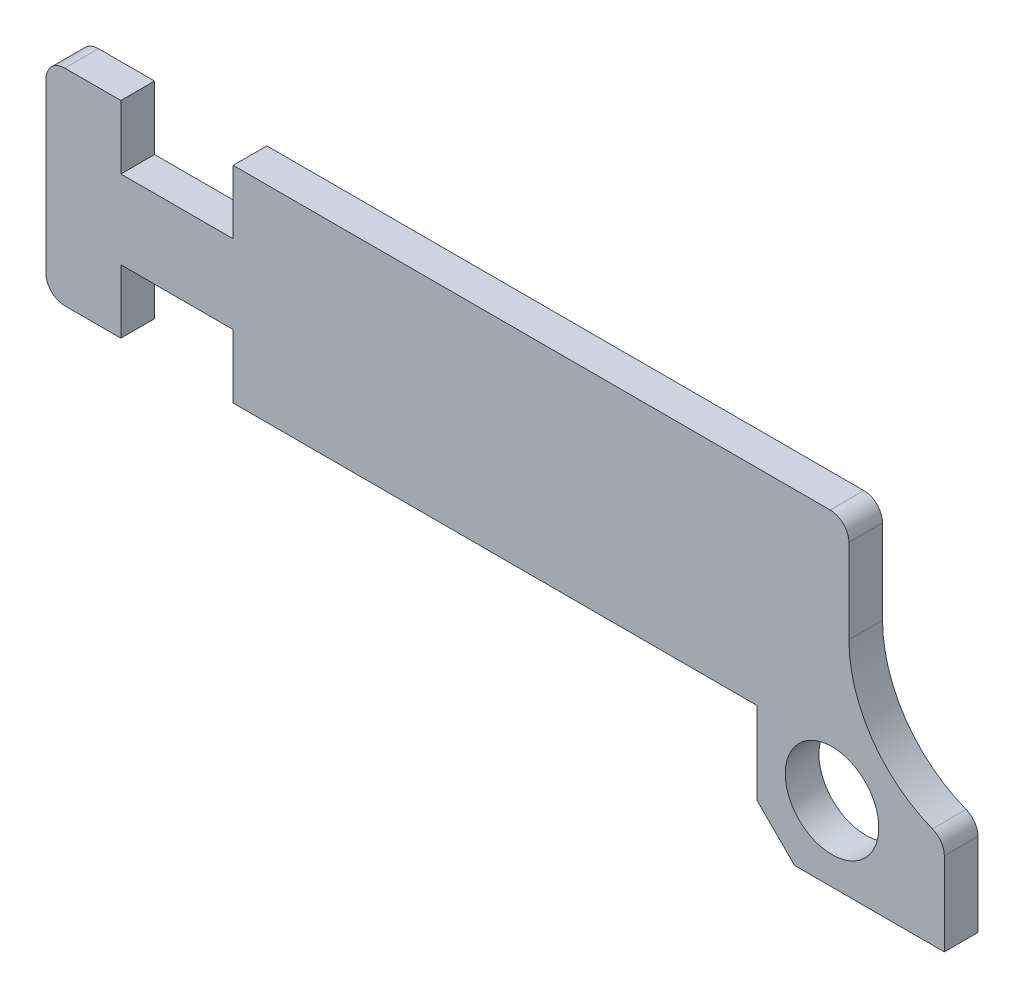
ISO-10303-21;
HEADER;
FILE_DESCRIPTION(('STEP AP214'),'2;1');
FILE_NAME('part.step','',(''),(''),'','','');
FILE_SCHEMA(('AUTOMOTIVE_DESIGN { 1 0 10303 214 1 1 1 1 }'));
ENDSEC;
DATA;
#1=APPLICATION_CONTEXT('core data for automotive mechanical design processes');
#2=APPLICATION_PROTOCOL_DEFINITION('international standard','automotive_design',2000,#1);
#3=PRODUCT_CONTEXT('',#1,'mechanical');
#4=PRODUCT('Part','Part','',(#3));
#5=PRODUCT_RELATED_PRODUCT_CATEGORY('part','',(#4));
#6=PRODUCT_DEFINITION_FORMATION('','',#4);
#7=PRODUCT_DEFINITION_CONTEXT('part definition',#1,'design');
#8=PRODUCT_DEFINITION('design','',#6,#7);
#9=PRODUCT_DEFINITION_SHAPE('','',#8);
#10=(LENGTH_UNIT() NAMED_UNIT(*) SI_UNIT(.MILLI.,.METRE.));
#11=(NAMED_UNIT(*) PLANE_ANGLE_UNIT() SI_UNIT($,.RADIAN.));
#12=(NAMED_UNIT(*) SI_UNIT($,.STERADIAN.) SOLID_ANGLE_UNIT());
#13=UNCERTAINTY_MEASURE_WITH_UNIT(LENGTH_MEASURE(1.E-05),#10,'distance_accuracy_value','');
#14=(GEOMETRIC_REPRESENTATION_CONTEXT(3) GLOBAL_UNCERTAINTY_ASSIGNED_CONTEXT((#13)) GLOBAL_UNIT_ASSIGNED_CONTEXT((#10,
#11,#12)) REPRESENTATION_CONTEXT('',''));
#15=CARTESIAN_POINT('',(0.,0.,0.));
#16=DIRECTION('',(0.,0.,1.));
#17=DIRECTION('',(1.,0.,0.));
#18=AXIS2_PLACEMENT_3D('',#15,#16,#17);
#19=CARTESIAN_POINT('',(-12.48691210598,-0.852250789584,0.9));
#20=DIRECTION('',(0.,0.,1.));
#21=DIRECTION('',(1.,0.,0.));
#22=AXIS2_PLACEMENT_3D('',#19,#20,#21);
#23=PLANE('',#22);
#24=CARTESIAN_POINT('',(-3.95,-3.95,0.9));
#25=DIRECTION('',(0.,0.,1.));
#26=DIRECTION('',(1.,0.,0.));
#27=AXIS2_PLACEMENT_3D('',#24,#25,#26);
#28=CIRCLE('',#27,1.25);
#29=CARTESIAN_POINT('',(-5.2,-3.95,0.9));
#30=VERTEX_POINT('',#29);
#31=EDGE_CURVE('E11',#30,#30,#28,.T.);
#32=ORIENTED_EDGE('',*,*,#31,.F.);
#33=EDGE_LOOP('',(#32));
#34=FACE_BOUND('',#33,.T.);
#35=DIRECTION('',(0.,1.,0.));
#36=VECTOR('',#35,1.);
#37=CARTESIAN_POINT('',(-5.95,-5.95,0.9));
#38=LINE('',#37,#36);
#39=CARTESIAN_POINT('',(-5.95,-4.95,0.9));
#40=VERTEX_POINT('',#39);
#41=CARTESIAN_POINT('',(-5.95,-2.75,0.9));
#42=VERTEX_POINT('',#41);
#43=EDGE_CURVE('E356',#40,#42,#38,.T.);
#44=ORIENTED_EDGE('',*,*,#43,.F.);
#45=DIRECTION('',(0.707106781186548,-0.707106781186548,0.));
#46=VECTOR('',#45,1.);
#47=CARTESIAN_POINT('',(-8.3586653291,-2.5413346709,0.9));
#48=LINE('',#47,#46);
#49=CARTESIAN_POINT('',(-4.95,-5.95,0.9));
#50=VERTEX_POINT('',#49);
#51=EDGE_CURVE('E315',#40,#50,#48,.T.);
#52=ORIENTED_EDGE('',*,*,#51,.T.);
#53=DIRECTION('',(-1.,0.,0.));
#54=VECTOR('',#53,1.);
#55=CARTESIAN_POINT('',(-0.95,-5.95,0.9));
#56=LINE('',#55,#54);
#57=CARTESIAN_POINT('',(-0.95,-5.95,0.9));
#58=VERTEX_POINT('',#57);
#59=EDGE_CURVE('E398',#58,#50,#56,.T.);
#60=ORIENTED_EDGE('',*,*,#59,.F.);
#61=DIRECTION('',(0.,-1.,0.));
#62=VECTOR('',#61,1.);
#63=CARTESIAN_POINT('',(-0.95,-3.727935085272,0.9));
#64=LINE('',#63,#62);
#65=CARTESIAN_POINT('',(-0.95,-3.727935085272,0.9));
#66=VERTEX_POINT('',#65);
#67=EDGE_CURVE('E282',#66,#58,#64,.T.);
#68=ORIENTED_EDGE('',*,*,#67,.F.);
#69=CARTESIAN_POINT('',(-1.45,-3.727935085272,0.9));
#70=DIRECTION('',(0.,0.,1.));
#71=DIRECTION('',(1.,0.,0.));
#72=AXIS2_PLACEMENT_3D('',#69,#70,#71);
#73=CIRCLE('',#72,0.5);
#74=CARTESIAN_POINT('',(-1.26875,-3.261943199613,0.9));
#75=VERTEX_POINT('',#74);
#76=EDGE_CURVE('E291',#66,#75,#73,.T.);
#77=ORIENTED_EDGE('',*,*,#76,.T.);
#78=CARTESIAN_POINT('',(0.,0.,0.9));
#79=DIRECTION('',(0.,0.,1.));
#80=DIRECTION('',(1.,0.,0.));
#81=AXIS2_PLACEMENT_3D('',#78,#79,#80);
#82=CIRCLE('',#81,3.5);
#83=CARTESIAN_POINT('',(-3.5,0.,0.9));
#84=VERTEX_POINT('',#83);
#85=EDGE_CURVE('E270',#84,#75,#82,.T.);
#86=ORIENTED_EDGE('',*,*,#85,.F.);
#87=DIRECTION('',(0.,-1.,0.));
#88=VECTOR('',#87,1.);
#89=CARTESIAN_POINT('',(-3.5,2.25,0.9));
#90=LINE('',#89,#88);
#91=CARTESIAN_POINT('',(-3.5,2.25,0.9));
#92=VERTEX_POINT('',#91);
#93=EDGE_CURVE('E418',#92,#84,#90,.T.);
#94=ORIENTED_EDGE('',*,*,#93,.F.);
#95=CARTESIAN_POINT('',(-4.,2.25,0.9));
#96=DIRECTION('',(0.,0.,1.));
#97=DIRECTION('',(1.,0.,0.));
#98=AXIS2_PLACEMENT_3D('',#95,#96,#97);
#99=CIRCLE('',#98,0.5);
#100=CARTESIAN_POINT('',(-4.,2.75,0.9));
#101=VERTEX_POINT('',#100);
#102=EDGE_CURVE('E283',#92,#101,#99,.T.);
#103=ORIENTED_EDGE('',*,*,#102,.T.);
#104=DIRECTION('',(1.,0.,0.));
#105=VECTOR('',#104,1.);
#106=CARTESIAN_POINT('',(-24.95,2.75,0.9));
#107=LINE('',#106,#105);
#108=CARTESIAN_POINT('',(-19.95,2.75,0.9));
#109=VERTEX_POINT('',#108);
#110=EDGE_CURVE('E266',#109,#101,#107,.T.);
#111=ORIENTED_EDGE('',*,*,#110,.F.);
#112=DIRECTION('',(0.,-1.,0.));
#113=VECTOR('',#112,1.);
#114=CARTESIAN_POINT('',(-19.95,2.75,0.9));
#115=LINE('',#114,#113);
#116=CARTESIAN_POINT('',(-19.95,1.05,0.9));
#117=VERTEX_POINT('',#116);
#118=EDGE_CURVE('E339',#109,#117,#115,.T.);
#119=ORIENTED_EDGE('',*,*,#118,.T.);
#120=DIRECTION('',(-1.,0.,0.));
#121=VECTOR('',#120,1.);
#122=CARTESIAN_POINT('',(-19.95,1.05,0.9));
#123=LINE('',#122,#121);
#124=CARTESIAN_POINT('',(-22.95,1.05,0.9));
#125=VERTEX_POINT('',#124);
#126=EDGE_CURVE('E386',#117,#125,#123,.T.);
#127=ORIENTED_EDGE('',*,*,#126,.T.);
#128=DIRECTION('',(0.,1.,0.));
#129=VECTOR('',#128,1.);
#130=CARTESIAN_POINT('',(-22.95,1.05,0.9));
#131=LINE('',#130,#129);
#132=CARTESIAN_POINT('',(-22.95,2.75,0.9));
#133=VERTEX_POINT('',#132);
#134=EDGE_CURVE('E257',#125,#133,#131,.T.);
#135=ORIENTED_EDGE('',*,*,#134,.T.);
#136=DIRECTION('',(1.,0.,0.));
#137=VECTOR('',#136,1.);
#138=CARTESIAN_POINT('',(-24.95,2.75,0.9));
#139=LINE('',#138,#137);
#140=CARTESIAN_POINT('',(-24.45,2.75,0.9));
#141=VERTEX_POINT('',#140);
#142=EDGE_CURVE('E390',#141,#133,#139,.T.);
#143=ORIENTED_EDGE('',*,*,#142,.F.);
#144=CARTESIAN_POINT('',(-24.45,2.25,0.9));
#145=DIRECTION('',(0.,0.,-1.));
#146=DIRECTION('',(0.,-1.,0.));
#147=AXIS2_PLACEMENT_3D('',#144,#145,#146);
#148=CIRCLE('',#147,0.5);
#149=CARTESIAN_POINT('',(-24.95,2.25,0.9));
#150=VERTEX_POINT('',#149);
#151=EDGE_CURVE('E261',#150,#141,#148,.T.);
#152=ORIENTED_EDGE('',*,*,#151,.F.);
#153=DIRECTION('',(0.,-1.,0.));
#154=VECTOR('',#153,1.);
#155=CARTESIAN_POINT('',(-24.95,2.75,0.9));
#156=LINE('',#155,#154);
#157=CARTESIAN_POINT('',(-24.95,-2.25,0.9));
#158=VERTEX_POINT('',#157);
#159=EDGE_CURVE('E287',#150,#158,#156,.T.);
#160=ORIENTED_EDGE('',*,*,#159,.T.);
#161=CARTESIAN_POINT('',(-24.45,-2.25,0.9));
#162=DIRECTION('',(0.,0.,-1.));
#163=DIRECTION('',(0.,-1.,0.));
#164=AXIS2_PLACEMENT_3D('',#161,#162,#163);
#165=CIRCLE('',#164,0.5);
#166=CARTESIAN_POINT('',(-24.45,-2.75,0.9));
#167=VERTEX_POINT('',#166);
#168=EDGE_CURVE('E218',#167,#158,#165,.T.);
#169=ORIENTED_EDGE('',*,*,#168,.F.);
#170=DIRECTION('',(-1.,0.,0.));
#171=VECTOR('',#170,1.);
#172=CARTESIAN_POINT('',(-5.95,-2.75,0.9));
#173=LINE('',#172,#171);
#174=CARTESIAN_POINT('',(-22.95,-2.75,0.9));
#175=VERTEX_POINT('',#174);
#176=EDGE_CURVE('E334',#175,#167,#173,.T.);
#177=ORIENTED_EDGE('',*,*,#176,.F.);
#178=DIRECTION('',(0.,-1.,0.));
#179=VECTOR('',#178,1.);
#180=CARTESIAN_POINT('',(-22.95,-1.049999999973,0.9));
#181=LINE('',#180,#179);
#182=CARTESIAN_POINT('',(-22.95,-1.049999999973,0.9));
#183=VERTEX_POINT('',#182);
#184=EDGE_CURVE('E256',#183,#175,#181,.T.);
#185=ORIENTED_EDGE('',*,*,#184,.F.);
#186=DIRECTION('',(-1.,0.,0.));
#187=VECTOR('',#186,1.);
#188=CARTESIAN_POINT('',(-19.95,-1.049999999973,0.9));
#189=LINE('',#188,#187);
#190=CARTESIAN_POINT('',(-19.95,-1.049999999973,0.9));
#191=VERTEX_POINT('',#190);
#192=EDGE_CURVE('E277',#191,#183,#189,.T.);
#193=ORIENTED_EDGE('',*,*,#192,.F.);
#194=DIRECTION('',(0.,1.,0.));
#195=VECTOR('',#194,1.);
#196=CARTESIAN_POINT('',(-19.95,-2.75,0.9));
#197=LINE('',#196,#195);
#198=CARTESIAN_POINT('',(-19.95,-2.75,0.9));
#199=VERTEX_POINT('',#198);
#200=EDGE_CURVE('E343',#199,#191,#197,.T.);
#201=ORIENTED_EDGE('',*,*,#200,.F.);
#202=DIRECTION('',(-1.,0.,0.));
#203=VECTOR('',#202,1.);
#204=CARTESIAN_POINT('',(-5.95,-2.75,0.9));
#205=LINE('',#204,#203);
#206=EDGE_CURVE('E312',#42,#199,#205,.T.);
#207=ORIENTED_EDGE('',*,*,#206,.F.);
#208=EDGE_LOOP('',(#44,#52,#60,#68,#77,#86,#94,#103,#111,#119,#127,#135,#143,#152,#160,#169,
#177,#185,#193,#201,#207));
#209=FACE_BOUND('',#208,.T.);
#210=ADVANCED_FACE('F17',(#34,#209),#23,.T.);
#211=CARTESIAN_POINT('',(-3.95,-3.95,0.9));
#212=DIRECTION('',(0.,0.,1.));
#213=DIRECTION('',(1.,0.,0.));
#214=AXIS2_PLACEMENT_3D('',#211,#212,#213);
#215=CYLINDRICAL_SURFACE('',#214,1.25);
#216=CARTESIAN_POINT('',(-3.95,-3.95,0.));
#217=DIRECTION('',(0.,0.,1.));
#218=DIRECTION('',(1.,0.,0.));
#219=AXIS2_PLACEMENT_3D('',#216,#217,#218);
#220=CIRCLE('',#219,1.25);
#221=CARTESIAN_POINT('',(-5.2,-3.95,0.));
#222=VERTEX_POINT('',#221);
#223=EDGE_CURVE('E382',#222,#222,#220,.T.);
#224=ORIENTED_EDGE('',*,*,#223,.F.);
#225=DIRECTION('',(0.,0.,1.));
#226=VECTOR('',#225,1.);
#227=CARTESIAN_POINT('',(-5.2,-3.95,0.9));
#228=LINE('',#227,#226);
#229=EDGE_CURVE('E28',#222,#30,#228,.T.);
#230=ORIENTED_EDGE('',*,*,#229,.T.);
#231=ORIENTED_EDGE('',*,*,#31,.T.);
#232=ORIENTED_EDGE('',*,*,#229,.F.);
#233=EDGE_LOOP('',(#224,#230,#231,#232));
#234=FACE_BOUND('',#233,.T.);
#235=ADVANCED_FACE('F19',(#234),#215,.F.);
#236=CARTESIAN_POINT('',(-22.95,1.05,0.9));
#237=DIRECTION('',(1.,0.,0.));
#238=DIRECTION('',(0.,1.,0.));
#239=AXIS2_PLACEMENT_3D('',#236,#237,#238);
#240=PLANE('',#239);
#241=ORIENTED_EDGE('',*,*,#134,.F.);
#242=DIRECTION('',(0.,0.,-1.));
#243=VECTOR('',#242,1.);
#244=CARTESIAN_POINT('',(-22.95,1.05,0.9));
#245=LINE('',#244,#243);
#246=CARTESIAN_POINT('',(-22.95,1.05,0.));
#247=VERTEX_POINT('',#246);
#248=EDGE_CURVE('E260',#125,#247,#245,.T.);
#249=ORIENTED_EDGE('',*,*,#248,.T.);
#250=DIRECTION('',(0.,1.,0.));
#251=VECTOR('',#250,1.);
#252=CARTESIAN_POINT('',(-22.95,0.09887460520782,0.));
#253=LINE('',#252,#251);
#254=CARTESIAN_POINT('',(-22.95,2.75,0.));
#255=VERTEX_POINT('',#254);
#256=EDGE_CURVE('E292',#247,#255,#253,.T.);
#257=ORIENTED_EDGE('',*,*,#256,.T.);
#258=DIRECTION('',(0.,0.,-1.));
#259=VECTOR('',#258,1.);
#260=CARTESIAN_POINT('',(-22.95,2.75,0.9));
#261=LINE('',#260,#259);
#262=EDGE_CURVE('E394',#133,#255,#261,.T.);
#263=ORIENTED_EDGE('',*,*,#262,.F.);
#264=EDGE_LOOP('',(#241,#249,#257,#263));
#265=FACE_BOUND('',#264,.T.);
#266=ADVANCED_FACE('F597',(#265),#240,.T.);
#267=CARTESIAN_POINT('',(-19.95,1.05,0.9));
#268=DIRECTION('',(0.,1.,0.));
#269=DIRECTION('',(1.,0.,0.));
#270=AXIS2_PLACEMENT_3D('',#267,#268,#269);
#271=PLANE('',#270);
#272=ORIENTED_EDGE('',*,*,#126,.F.);
#273=DIRECTION('',(0.,0.,-1.));
#274=VECTOR('',#273,1.);
#275=CARTESIAN_POINT('',(-19.95,1.05,0.9));
#276=LINE('',#275,#274);
#277=CARTESIAN_POINT('',(-19.95,1.05,0.));
#278=VERTEX_POINT('',#277);
#279=EDGE_CURVE('E377',#117,#278,#276,.T.);
#280=ORIENTED_EDGE('',*,*,#279,.T.);
#281=DIRECTION('',(-1.,0.,0.));
#282=VECTOR('',#281,1.);
#283=CARTESIAN_POINT('',(-16.21845605299,1.05,0.));
#284=LINE('',#283,#282);
#285=EDGE_CURVE('E296',#278,#247,#284,.T.);
#286=ORIENTED_EDGE('',*,*,#285,.T.);
#287=ORIENTED_EDGE('',*,*,#248,.F.);
#288=EDGE_LOOP('',(#272,#280,#286,#287));
#289=FACE_BOUND('',#288,.T.);
#290=ADVANCED_FACE('F591',(#289),#271,.T.);
#291=CARTESIAN_POINT('',(-24.95,2.75,0.));
#292=DIRECTION('',(0.,1.,0.));
#293=DIRECTION('',(1.,0.,0.));
#294=AXIS2_PLACEMENT_3D('',#291,#292,#293);
#295=PLANE('',#294);
#296=DIRECTION('',(1.,0.,0.));
#297=VECTOR('',#296,1.);
#298=CARTESIAN_POINT('',(-24.95,2.75,0.));
#299=LINE('',#298,#297);
#300=CARTESIAN_POINT('',(-24.45,2.75,0.));
#301=VERTEX_POINT('',#300);
#302=EDGE_CURVE('E297',#301,#255,#299,.T.);
#303=ORIENTED_EDGE('',*,*,#302,.F.);
#304=DIRECTION('',(0.,0.,1.));
#305=VECTOR('',#304,1.);
#306=CARTESIAN_POINT('',(-24.45,2.75,0.));
#307=LINE('',#306,#305);
#308=EDGE_CURVE('E265',#301,#141,#307,.T.);
#309=ORIENTED_EDGE('',*,*,#308,.T.);
#310=ORIENTED_EDGE('',*,*,#142,.T.);
#311=ORIENTED_EDGE('',*,*,#262,.T.);
#312=EDGE_LOOP('',(#303,#309,#310,#311));
#313=FACE_BOUND('',#312,.T.);
#314=ADVANCED_FACE('F585',(#313),#295,.T.);
#315=CARTESIAN_POINT('',(-19.95,2.75,0.9));
#316=DIRECTION('',(-1.,0.,0.));
#317=DIRECTION('',(0.,0.,1.));
#318=AXIS2_PLACEMENT_3D('',#315,#316,#317);
#319=PLANE('',#318);
#320=ORIENTED_EDGE('',*,*,#118,.F.);
#321=DIRECTION('',(0.,0.,-1.));
#322=VECTOR('',#321,1.);
#323=CARTESIAN_POINT('',(-19.95,2.75,0.9));
#324=LINE('',#323,#322);
#325=CARTESIAN_POINT('',(-19.95,2.75,0.));
#326=VERTEX_POINT('',#325);
#327=EDGE_CURVE('E347',#109,#326,#324,.T.);
#328=ORIENTED_EDGE('',*,*,#327,.T.);
#329=DIRECTION('',(0.,-1.,0.));
#330=VECTOR('',#329,1.);
#331=CARTESIAN_POINT('',(-19.95,0.948874605208,0.));
#332=LINE('',#331,#330);
#333=EDGE_CURVE('E304',#326,#278,#332,.T.);
#334=ORIENTED_EDGE('',*,*,#333,.T.);
#335=ORIENTED_EDGE('',*,*,#279,.F.);
#336=EDGE_LOOP('',(#320,#328,#334,#335));
#337=FACE_BOUND('',#336,.T.);
#338=ADVANCED_FACE('F590',(#337),#319,.T.);
#339=CARTESIAN_POINT('',(-24.45,2.25,0.));
#340=DIRECTION('',(0.,0.,1.));
#341=DIRECTION('',(-1.,0.,0.));
#342=AXIS2_PLACEMENT_3D('',#339,#340,#341);
#343=CYLINDRICAL_SURFACE('',#342,0.5);
#344=CARTESIAN_POINT('',(-24.45,2.25,0.));
#345=DIRECTION('',(0.,0.,-1.));
#346=DIRECTION('',(0.,-1.,0.));
#347=AXIS2_PLACEMENT_3D('',#344,#345,#346);
#348=CIRCLE('',#347,0.5);
#349=CARTESIAN_POINT('',(-24.95,2.25,0.));
#350=VERTEX_POINT('',#349);
#351=EDGE_CURVE('E233',#350,#301,#348,.T.);
#352=ORIENTED_EDGE('',*,*,#351,.F.);
#353=DIRECTION('',(0.,0.,1.));
#354=VECTOR('',#353,1.);
#355=CARTESIAN_POINT('',(-24.95,2.25,0.));
#356=LINE('',#355,#354);
#357=EDGE_CURVE('E228',#350,#150,#356,.T.);
#358=ORIENTED_EDGE('',*,*,#357,.T.);
#359=ORIENTED_EDGE('',*,*,#151,.T.);
#360=ORIENTED_EDGE('',*,*,#308,.F.);
#361=EDGE_LOOP('',(#352,#358,#359,#360));
#362=FACE_BOUND('',#361,.T.);
#363=ADVANCED_FACE('F607',(#362),#343,.T.);
#364=CARTESIAN_POINT('',(-24.95,2.75,0.));
#365=DIRECTION('',(0.,1.,0.));
#366=DIRECTION('',(1.,0.,0.));
#367=AXIS2_PLACEMENT_3D('',#364,#365,#366);
#368=PLANE('',#367);
#369=DIRECTION('',(1.,0.,0.));
#370=VECTOR('',#369,1.);
#371=CARTESIAN_POINT('',(-24.95,2.75,0.));
#372=LINE('',#371,#370);
#373=CARTESIAN_POINT('',(-4.,2.75,0.));
#374=VERTEX_POINT('',#373);
#375=EDGE_CURVE('E308',#326,#374,#372,.T.);
#376=ORIENTED_EDGE('',*,*,#375,.F.);
#377=ORIENTED_EDGE('',*,*,#327,.F.);
#378=ORIENTED_EDGE('',*,*,#110,.T.);
#379=DIRECTION('',(0.,0.,1.));
#380=VECTOR('',#379,1.);
#381=CARTESIAN_POINT('',(-4.,2.75,0.));
#382=LINE('',#381,#380);
#383=EDGE_CURVE('E222',#374,#101,#382,.T.);
#384=ORIENTED_EDGE('',*,*,#383,.F.);
#385=EDGE_LOOP('',(#376,#377,#378,#384));
#386=FACE_BOUND('',#385,.T.);
#387=ADVANCED_FACE('F612',(#386),#368,.T.);
#388=CARTESIAN_POINT('',(-24.95,2.75,0.));
#389=DIRECTION('',(1.,0.,0.));
#390=DIRECTION('',(0.,1.,0.));
#391=AXIS2_PLACEMENT_3D('',#388,#389,#390);
#392=PLANE('',#391);
#393=DIRECTION('',(0.,-1.,0.));
#394=VECTOR('',#393,1.);
#395=CARTESIAN_POINT('',(-24.95,2.75,0.));
#396=LINE('',#395,#394);
#397=CARTESIAN_POINT('',(-24.95,-2.25,0.));
#398=VERTEX_POINT('',#397);
#399=EDGE_CURVE('E225',#350,#398,#396,.T.);
#400=ORIENTED_EDGE('',*,*,#399,.T.);
#401=DIRECTION('',(0.,0.,1.));
#402=VECTOR('',#401,1.);
#403=CARTESIAN_POINT('',(-24.95,-2.25,0.));
#404=LINE('',#403,#402);
#405=EDGE_CURVE('E211',#398,#158,#404,.T.);
#406=ORIENTED_EDGE('',*,*,#405,.T.);
#407=ORIENTED_EDGE('',*,*,#159,.F.);
#408=ORIENTED_EDGE('',*,*,#357,.F.);
#409=EDGE_LOOP('',(#400,#406,#407,#408));
#410=FACE_BOUND('',#409,.T.);
#411=ADVANCED_FACE('F226',(#410),#392,.F.);
#412=CARTESIAN_POINT('',(-4.,2.25,0.));
#413=DIRECTION('',(0.,0.,-1.));
#414=DIRECTION('',(1.,0.,0.));
#415=AXIS2_PLACEMENT_3D('',#412,#413,#414);
#416=CYLINDRICAL_SURFACE('',#415,0.5);
#417=DIRECTION('',(0.,0.,1.));
#418=VECTOR('',#417,1.);
#419=CARTESIAN_POINT('',(-3.5,2.25,0.));
#420=LINE('',#419,#418);
#421=CARTESIAN_POINT('',(-3.5,2.25,0.));
#422=VERTEX_POINT('',#421);
#423=EDGE_CURVE('E414',#422,#92,#420,.T.);
#424=ORIENTED_EDGE('',*,*,#423,.F.);
#425=CARTESIAN_POINT('',(-4.,2.25,0.));
#426=DIRECTION('',(0.,0.,1.));
#427=DIRECTION('',(1.,0.,0.));
#428=AXIS2_PLACEMENT_3D('',#425,#426,#427);
#429=CIRCLE('',#428,0.5);
#430=EDGE_CURVE('E276',#422,#374,#429,.T.);
#431=ORIENTED_EDGE('',*,*,#430,.T.);
#432=ORIENTED_EDGE('',*,*,#383,.T.);
#433=ORIENTED_EDGE('',*,*,#102,.F.);
#434=EDGE_LOOP('',(#424,#431,#432,#433));
#435=FACE_BOUND('',#434,.T.);
#436=ADVANCED_FACE('F644',(#435),#416,.T.);
#437=CARTESIAN_POINT('',(-24.45,-2.25,0.));
#438=DIRECTION('',(0.,0.,1.));
#439=DIRECTION('',(0.,-1.,0.));
#440=AXIS2_PLACEMENT_3D('',#437,#438,#439);
#441=CYLINDRICAL_SURFACE('',#440,0.5);
#442=CARTESIAN_POINT('',(-24.45,-2.25,0.));
#443=DIRECTION('',(0.,0.,-1.));
#444=DIRECTION('',(0.,-1.,0.));
#445=AXIS2_PLACEMENT_3D('',#442,#443,#444);
#446=CIRCLE('',#445,0.5);
#447=CARTESIAN_POINT('',(-24.45,-2.75,0.));
#448=VERTEX_POINT('',#447);
#449=EDGE_CURVE('E216',#448,#398,#446,.T.);
#450=ORIENTED_EDGE('',*,*,#449,.F.);
#451=DIRECTION('',(0.,0.,1.));
#452=VECTOR('',#451,1.);
#453=CARTESIAN_POINT('',(-24.45,-2.75,0.));
#454=LINE('',#453,#452);
#455=EDGE_CURVE('E419',#448,#167,#454,.T.);
#456=ORIENTED_EDGE('',*,*,#455,.T.);
#457=ORIENTED_EDGE('',*,*,#168,.T.);
#458=ORIENTED_EDGE('',*,*,#405,.F.);
#459=EDGE_LOOP('',(#450,#456,#457,#458));
#460=FACE_BOUND('',#459,.T.);
#461=ADVANCED_FACE('F213',(#460),#441,.T.);
#462=CARTESIAN_POINT('',(-3.5,2.25,0.));
#463=DIRECTION('',(1.,0.,0.));
#464=DIRECTION('',(0.,1.,0.));
#465=AXIS2_PLACEMENT_3D('',#462,#463,#464);
#466=PLANE('',#465);
#467=ORIENTED_EDGE('',*,*,#423,.T.);
#468=ORIENTED_EDGE('',*,*,#93,.T.);
#469=DIRECTION('',(0.,0.,1.));
#470=VECTOR('',#469,1.);
#471=CARTESIAN_POINT('',(-3.5,0.,0.));
#472=LINE('',#471,#470);
#473=CARTESIAN_POINT('',(-3.5,0.,0.));
#474=VERTEX_POINT('',#473);
#475=EDGE_CURVE('E255',#474,#84,#472,.T.);
#476=ORIENTED_EDGE('',*,*,#475,.F.);
#477=DIRECTION('',(0.,-1.,0.));
#478=VECTOR('',#477,1.);
#479=CARTESIAN_POINT('',(-3.5,2.25,0.));
#480=LINE('',#479,#478);
#481=EDGE_CURVE('E271',#422,#474,#480,.T.);
#482=ORIENTED_EDGE('',*,*,#481,.F.);
#483=EDGE_LOOP('',(#467,#468,#476,#482));
#484=FACE_BOUND('',#483,.T.);
#485=ADVANCED_FACE('F670',(#484),#466,.T.);
#486=CARTESIAN_POINT('',(-5.95,-2.75,0.));
#487=DIRECTION('',(0.,-1.,0.));
#488=DIRECTION('',(0.,0.,-1.));
#489=AXIS2_PLACEMENT_3D('',#486,#487,#488);
#490=PLANE('',#489);
#491=DIRECTION('',(-1.,0.,0.));
#492=VECTOR('',#491,1.);
#493=CARTESIAN_POINT('',(-5.95,-2.75,0.));
#494=LINE('',#493,#492);
#495=CARTESIAN_POINT('',(-22.95,-2.75,0.));
#496=VERTEX_POINT('',#495);
#497=EDGE_CURVE('E239',#496,#448,#494,.T.);
#498=ORIENTED_EDGE('',*,*,#497,.F.);
#499=DIRECTION('',(0.,0.,-1.));
#500=VECTOR('',#499,1.);
#501=CARTESIAN_POINT('',(-22.95,-2.75,0.9));
#502=LINE('',#501,#500);
#503=EDGE_CURVE('E252',#175,#496,#502,.T.);
#504=ORIENTED_EDGE('',*,*,#503,.F.);
#505=ORIENTED_EDGE('',*,*,#176,.T.);
#506=ORIENTED_EDGE('',*,*,#455,.F.);
#507=EDGE_LOOP('',(#498,#504,#505,#506));
#508=FACE_BOUND('',#507,.T.);
#509=ADVANCED_FACE('F680',(#508),#490,.T.);
#510=CARTESIAN_POINT('',(0.,0.,0.));
#511=DIRECTION('',(0.,0.,-1.));
#512=DIRECTION('',(1.,0.,0.));
#513=AXIS2_PLACEMENT_3D('',#510,#511,#512);
#514=CYLINDRICAL_SURFACE('',#513,3.5);
#515=ORIENTED_EDGE('',*,*,#475,.T.);
#516=ORIENTED_EDGE('',*,*,#85,.T.);
#517=DIRECTION('',(0.,0.,1.));
#518=VECTOR('',#517,1.);
#519=CARTESIAN_POINT('',(-1.26875,-3.261943199613,0.));
#520=LINE('',#519,#518);
#521=CARTESIAN_POINT('',(-1.26875,-3.261943199613,0.));
#522=VERTEX_POINT('',#521);
#523=EDGE_CURVE('E351',#522,#75,#520,.T.);
#524=ORIENTED_EDGE('',*,*,#523,.F.);
#525=CARTESIAN_POINT('',(0.,0.,0.));
#526=DIRECTION('',(0.,0.,1.));
#527=DIRECTION('',(1.,0.,0.));
#528=AXIS2_PLACEMENT_3D('',#525,#526,#527);
#529=CIRCLE('',#528,3.5);
#530=EDGE_CURVE('E275',#474,#522,#529,.T.);
#531=ORIENTED_EDGE('',*,*,#530,.F.);
#532=EDGE_LOOP('',(#515,#516,#524,#531));
#533=FACE_BOUND('',#532,.T.);
#534=ADVANCED_FACE('F675',(#533),#514,.F.);
#535=CARTESIAN_POINT('',(-22.95,-1.049999999973,0.9));
#536=DIRECTION('',(-1.,0.,0.));
#537=DIRECTION('',(0.,0.,1.));
#538=AXIS2_PLACEMENT_3D('',#535,#536,#537);
#539=PLANE('',#538);
#540=ORIENTED_EDGE('',*,*,#184,.T.);
#541=ORIENTED_EDGE('',*,*,#503,.T.);
#542=DIRECTION('',(0.,-1.,0.));
#543=VECTOR('',#542,1.);
#544=CARTESIAN_POINT('',(-22.95,-0.951125394779,0.));
#545=LINE('',#544,#543);
#546=CARTESIAN_POINT('',(-22.95,-1.049999999973,0.));
#547=VERTEX_POINT('',#546);
#548=EDGE_CURVE('E246',#547,#496,#545,.T.);
#549=ORIENTED_EDGE('',*,*,#548,.F.);
#550=DIRECTION('',(0.,0.,-1.));
#551=VECTOR('',#550,1.);
#552=CARTESIAN_POINT('',(-22.95,-1.049999999973,0.9));
#553=LINE('',#552,#551);
#554=EDGE_CURVE('E281',#183,#547,#553,.T.);
#555=ORIENTED_EDGE('',*,*,#554,.F.);
#556=EDGE_LOOP('',(#540,#541,#549,#555));
#557=FACE_BOUND('',#556,.T.);
#558=ADVANCED_FACE('F633',(#557),#539,.F.);
#559=CARTESIAN_POINT('',(-1.45,-3.727935085272,0.));
#560=DIRECTION('',(0.,0.,-1.));
#561=DIRECTION('',(1.,0.,0.));
#562=AXIS2_PLACEMENT_3D('',#559,#560,#561);
#563=CYLINDRICAL_SURFACE('',#562,0.5);
#564=DIRECTION('',(0.,0.,1.));
#565=VECTOR('',#564,1.);
#566=CARTESIAN_POINT('',(-0.95,-3.727935085272,0.));
#567=LINE('',#566,#565);
#568=CARTESIAN_POINT('',(-0.95,-3.727935085272,0.));
#569=VERTEX_POINT('',#568);
#570=EDGE_CURVE('E342',#569,#66,#567,.T.);
#571=ORIENTED_EDGE('',*,*,#570,.F.);
#572=CARTESIAN_POINT('',(-1.45,-3.727935085272,0.));
#573=DIRECTION('',(0.,0.,1.));
#574=DIRECTION('',(1.,0.,0.));
#575=AXIS2_PLACEMENT_3D('',#572,#573,#574);
#576=CIRCLE('',#575,0.5);
#577=EDGE_CURVE('E354',#569,#522,#576,.T.);
#578=ORIENTED_EDGE('',*,*,#577,.T.);
#579=ORIENTED_EDGE('',*,*,#523,.T.);
#580=ORIENTED_EDGE('',*,*,#76,.F.);
#581=EDGE_LOOP('',(#571,#578,#579,#580));
#582=FACE_BOUND('',#581,.T.);
#583=ADVANCED_FACE('F627',(#582),#563,.T.);
#584=CARTESIAN_POINT('',(-19.95,-1.049999999973,0.9));
#585=DIRECTION('',(0.,1.,0.));
#586=DIRECTION('',(1.,0.,0.));
#587=AXIS2_PLACEMENT_3D('',#584,#585,#586);
#588=PLANE('',#587);
#589=ORIENTED_EDGE('',*,*,#192,.T.);
#590=ORIENTED_EDGE('',*,*,#554,.T.);
#591=DIRECTION('',(-1.,0.,0.));
#592=VECTOR('',#591,1.);
#593=CARTESIAN_POINT('',(-16.21845605299,-1.049999999973,0.));
#594=LINE('',#593,#592);
#595=CARTESIAN_POINT('',(-19.95,-1.049999999973,0.));
#596=VERTEX_POINT('',#595);
#597=EDGE_CURVE('E367',#596,#547,#594,.T.);
#598=ORIENTED_EDGE('',*,*,#597,.F.);
#599=DIRECTION('',(0.,0.,-1.));
#600=VECTOR('',#599,1.);
#601=CARTESIAN_POINT('',(-19.95,-1.049999999973,0.9));
#602=LINE('',#601,#600);
#603=EDGE_CURVE('E340',#191,#596,#602,.T.);
#604=ORIENTED_EDGE('',*,*,#603,.F.);
#605=EDGE_LOOP('',(#589,#590,#598,#604));
#606=FACE_BOUND('',#605,.T.);
#607=ADVANCED_FACE('F632',(#606),#588,.F.);
#608=CARTESIAN_POINT('',(-0.95,-3.727935085272,0.));
#609=DIRECTION('',(1.,0.,0.));
#610=DIRECTION('',(0.,1.,0.));
#611=AXIS2_PLACEMENT_3D('',#608,#609,#610);
#612=PLANE('',#611);
#613=ORIENTED_EDGE('',*,*,#570,.T.);
#614=ORIENTED_EDGE('',*,*,#67,.T.);
#615=DIRECTION('',(0.,0.,1.));
#616=VECTOR('',#615,1.);
#617=CARTESIAN_POINT('',(-0.95,-5.95,0.));
#618=LINE('',#617,#616);
#619=CARTESIAN_POINT('',(-0.95,-5.95,0.));
#620=VERTEX_POINT('',#619);
#621=EDGE_CURVE('E311',#620,#58,#618,.T.);
#622=ORIENTED_EDGE('',*,*,#621,.F.);
#623=DIRECTION('',(0.,-1.,0.));
#624=VECTOR('',#623,1.);
#625=CARTESIAN_POINT('',(-0.95,-3.727935085272,0.));
#626=LINE('',#625,#624);
#627=EDGE_CURVE('E250',#569,#620,#626,.T.);
#628=ORIENTED_EDGE('',*,*,#627,.F.);
#629=EDGE_LOOP('',(#613,#614,#622,#628));
#630=FACE_BOUND('',#629,.T.);
#631=ADVANCED_FACE('F712',(#630),#612,.T.);
#632=CARTESIAN_POINT('',(-19.95,-2.75,0.9));
#633=DIRECTION('',(1.,0.,0.));
#634=DIRECTION('',(0.,1.,0.));
#635=AXIS2_PLACEMENT_3D('',#632,#633,#634);
#636=PLANE('',#635);
#637=ORIENTED_EDGE('',*,*,#200,.T.);
#638=ORIENTED_EDGE('',*,*,#603,.T.);
#639=DIRECTION('',(0.,1.,0.));
#640=VECTOR('',#639,1.);
#641=CARTESIAN_POINT('',(-19.95,-1.801125394792,0.));
#642=LINE('',#641,#640);
#643=CARTESIAN_POINT('',(-19.95,-2.75,0.));
#644=VERTEX_POINT('',#643);
#645=EDGE_CURVE('E302',#644,#596,#642,.T.);
#646=ORIENTED_EDGE('',*,*,#645,.F.);
#647=DIRECTION('',(0.,0.,-1.));
#648=VECTOR('',#647,1.);
#649=CARTESIAN_POINT('',(-19.95,-2.75,0.9));
#650=LINE('',#649,#648);
#651=EDGE_CURVE('E309',#199,#644,#650,.T.);
#652=ORIENTED_EDGE('',*,*,#651,.F.);
#653=EDGE_LOOP('',(#637,#638,#646,#652));
#654=FACE_BOUND('',#653,.T.);
#655=ADVANCED_FACE('F717',(#654),#636,.F.);
#656=CARTESIAN_POINT('',(-0.95,-5.95,0.));
#657=DIRECTION('',(0.,-1.,0.));
#658=DIRECTION('',(0.,0.,-1.));
#659=AXIS2_PLACEMENT_3D('',#656,#657,#658);
#660=PLANE('',#659);
#661=DIRECTION('',(-1.,0.,0.));
#662=VECTOR('',#661,1.);
#663=CARTESIAN_POINT('',(-0.95,-5.95,0.));
#664=LINE('',#663,#662);
#665=CARTESIAN_POINT('',(-4.95,-5.95,0.));
#666=VERTEX_POINT('',#665);
#667=EDGE_CURVE('E383',#620,#666,#664,.T.);
#668=ORIENTED_EDGE('',*,*,#667,.F.);
#669=ORIENTED_EDGE('',*,*,#621,.T.);
#670=ORIENTED_EDGE('',*,*,#59,.T.);
#671=DIRECTION('',(0.,0.,1.));
#672=VECTOR('',#671,1.);
#673=CARTESIAN_POINT('',(-4.95,-5.95,0.));
#674=LINE('',#673,#672);
#675=EDGE_CURVE('E322',#666,#50,#674,.T.);
#676=ORIENTED_EDGE('',*,*,#675,.F.);
#677=EDGE_LOOP('',(#668,#669,#670,#676));
#678=FACE_BOUND('',#677,.T.);
#679=ADVANCED_FACE('F726',(#678),#660,.T.);
#680=CARTESIAN_POINT('',(-5.95,-2.75,0.));
#681=DIRECTION('',(0.,-1.,0.));
#682=DIRECTION('',(0.,0.,-1.));
#683=AXIS2_PLACEMENT_3D('',#680,#681,#682);
#684=PLANE('',#683);
#685=DIRECTION('',(-1.,0.,0.));
#686=VECTOR('',#685,1.);
#687=CARTESIAN_POINT('',(-5.95,-2.75,0.));
#688=LINE('',#687,#686);
#689=CARTESIAN_POINT('',(-5.95,-2.75,0.));
#690=VERTEX_POINT('',#689);
#691=EDGE_CURVE('E298',#690,#644,#688,.T.);
#692=ORIENTED_EDGE('',*,*,#691,.F.);
#693=DIRECTION('',(0.,0.,1.));
#694=VECTOR('',#693,1.);
#695=CARTESIAN_POINT('',(-5.95,-2.75,0.));
#696=LINE('',#695,#694);
#697=EDGE_CURVE('E21',#690,#42,#696,.T.);
#698=ORIENTED_EDGE('',*,*,#697,.T.);
#699=ORIENTED_EDGE('',*,*,#206,.T.);
#700=ORIENTED_EDGE('',*,*,#651,.T.);
#701=EDGE_LOOP('',(#692,#698,#699,#700));
#702=FACE_BOUND('',#701,.T.);
#703=ADVANCED_FACE('F652',(#702),#684,.T.);
#704=CARTESIAN_POINT('',(-5.45,-5.45,0.));
#705=DIRECTION('',(-0.707106781186548,-0.707106781186548,0.));
#706=DIRECTION('',(-0.707106781186548,0.707106781186548,0.));
#707=AXIS2_PLACEMENT_3D('',#704,#705,#706);
#708=PLANE('',#707);
#709=DIRECTION('',(0.707106781186548,-0.707106781186548,0.));
#710=VECTOR('',#709,1.);
#711=CARTESIAN_POINT('',(-8.3586653291,-2.5413346709,0.));
#712=LINE('',#711,#710);
#713=CARTESIAN_POINT('',(-5.95,-4.95,0.));
#714=VERTEX_POINT('',#713);
#715=EDGE_CURVE('E378',#714,#666,#712,.T.);
#716=ORIENTED_EDGE('',*,*,#715,.T.);
#717=ORIENTED_EDGE('',*,*,#675,.T.);
#718=ORIENTED_EDGE('',*,*,#51,.F.);
#719=DIRECTION('',(0.,0.,1.));
#720=VECTOR('',#719,1.);
#721=CARTESIAN_POINT('',(-5.95,-4.95,0.));
#722=LINE('',#721,#720);
#723=EDGE_CURVE('E360',#714,#40,#722,.T.);
#724=ORIENTED_EDGE('',*,*,#723,.F.);
#725=EDGE_LOOP('',(#716,#717,#718,#724));
#726=FACE_BOUND('',#725,.T.);
#727=ADVANCED_FACE('F621',(#726),#708,.T.);
#728=CARTESIAN_POINT('',(-5.95,-5.95,0.));
#729=DIRECTION('',(-1.,0.,0.));
#730=DIRECTION('',(0.,0.,1.));
#731=AXIS2_PLACEMENT_3D('',#728,#729,#730);
#732=PLANE('',#731);
#733=DIRECTION('',(0.,1.,0.));
#734=VECTOR('',#733,1.);
#735=CARTESIAN_POINT('',(-5.95,-5.95,0.));
#736=LINE('',#735,#734);
#737=EDGE_CURVE('E303',#714,#690,#736,.T.);
#738=ORIENTED_EDGE('',*,*,#737,.F.);
#739=ORIENTED_EDGE('',*,*,#723,.T.);
#740=ORIENTED_EDGE('',*,*,#43,.T.);
#741=ORIENTED_EDGE('',*,*,#697,.F.);
#742=EDGE_LOOP('',(#738,#739,#740,#741));
#743=FACE_BOUND('',#742,.T.);
#744=ADVANCED_FACE('F579',(#743),#732,.T.);
#745=CARTESIAN_POINT('',(-12.48691210598,-0.852250789584,0.));
#746=DIRECTION('',(0.,0.,1.));
#747=DIRECTION('',(1.,0.,0.));
#748=AXIS2_PLACEMENT_3D('',#745,#746,#747);
#749=PLANE('',#748);
#750=ORIENTED_EDGE('',*,*,#223,.T.);
#751=EDGE_LOOP('',(#750));
#752=FACE_BOUND('',#751,.T.);
#753=ORIENTED_EDGE('',*,*,#737,.T.);
#754=ORIENTED_EDGE('',*,*,#691,.T.);
#755=ORIENTED_EDGE('',*,*,#645,.T.);
#756=ORIENTED_EDGE('',*,*,#597,.T.);
#757=ORIENTED_EDGE('',*,*,#548,.T.);
#758=ORIENTED_EDGE('',*,*,#497,.T.);
#759=ORIENTED_EDGE('',*,*,#449,.T.);
#760=ORIENTED_EDGE('',*,*,#399,.F.);
#761=ORIENTED_EDGE('',*,*,#351,.T.);
#762=ORIENTED_EDGE('',*,*,#302,.T.);
#763=ORIENTED_EDGE('',*,*,#256,.F.);
#764=ORIENTED_EDGE('',*,*,#285,.F.);
#765=ORIENTED_EDGE('',*,*,#333,.F.);
#766=ORIENTED_EDGE('',*,*,#375,.T.);
#767=ORIENTED_EDGE('',*,*,#430,.F.);
#768=ORIENTED_EDGE('',*,*,#481,.T.);
#769=ORIENTED_EDGE('',*,*,#530,.T.);
#770=ORIENTED_EDGE('',*,*,#577,.F.);
#771=ORIENTED_EDGE('',*,*,#627,.T.);
#772=ORIENTED_EDGE('',*,*,#667,.T.);
#773=ORIENTED_EDGE('',*,*,#715,.F.);
#774=EDGE_LOOP('',(#753,#754,#755,#756,#757,#758,#759,#760,#761,#762,#763,#764,#765,#766,#767,
#768,#769,#770,#771,#772,#773));
#775=FACE_BOUND('',#774,.T.);
#776=ADVANCED_FACE('F236',(#752,#775),#749,.F.);
#777=CLOSED_SHELL('',(#210,#235,#266,#290,#314,#338,#363,#387,#411,#436,#461,#485,#509,#534,
#558,#583,#607,#631,#655,#679,#703,#727,#744,#776));
#778=MANIFOLD_SOLID_BREP('B1',#777);
#779=ADVANCED_BREP_SHAPE_REPRESENTATION('',(#18,#778),#14);
#780=SHAPE_DEFINITION_REPRESENTATION(#9,#779);
ENDSEC;
END-ISO-10303-21;
